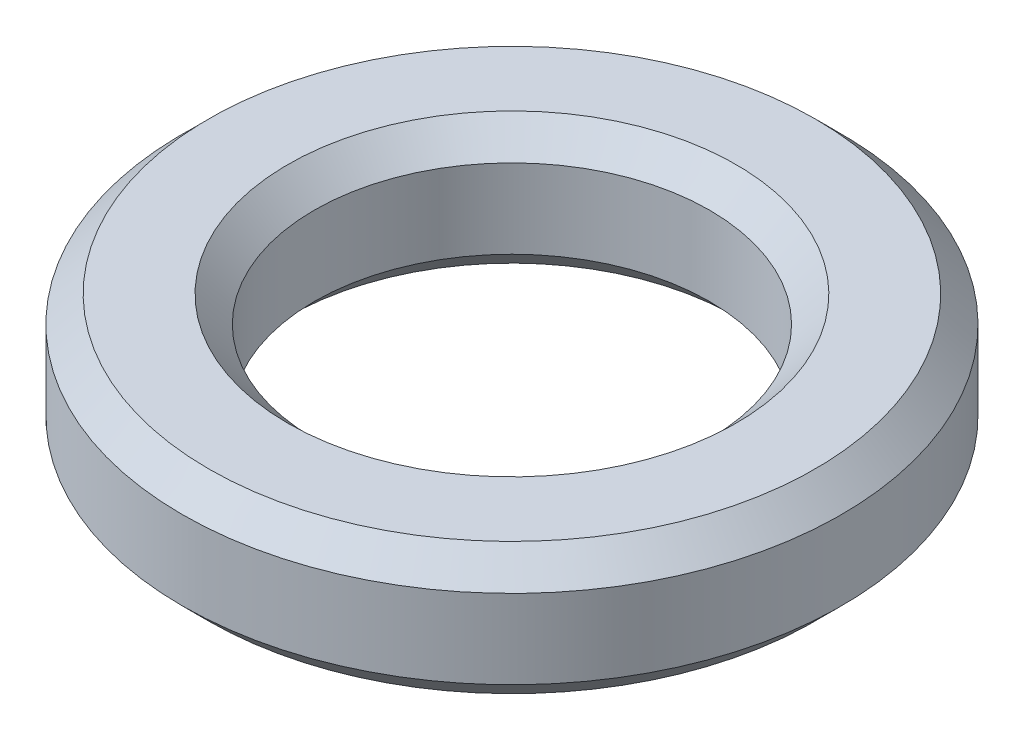
ISO-10303-21;
HEADER;
FILE_DESCRIPTION(('STEP AP214'),'2;1');
FILE_NAME('part.step','',(''),(''),'','','');
FILE_SCHEMA(('AUTOMOTIVE_DESIGN { 1 0 10303 214 1 1 1 1 }'));
ENDSEC;
DATA;
#1=APPLICATION_CONTEXT('core data for automotive mechanical design processes');
#2=APPLICATION_PROTOCOL_DEFINITION('international standard','automotive_design',2000,#1);
#3=PRODUCT_CONTEXT('',#1,'mechanical');
#4=PRODUCT('Part','Part','',(#3));
#5=PRODUCT_RELATED_PRODUCT_CATEGORY('part','',(#4));
#6=PRODUCT_DEFINITION_FORMATION('','',#4);
#7=PRODUCT_DEFINITION_CONTEXT('part definition',#1,'design');
#8=PRODUCT_DEFINITION('design','',#6,#7);
#9=PRODUCT_DEFINITION_SHAPE('','',#8);
#10=(LENGTH_UNIT() NAMED_UNIT(*) SI_UNIT(.MILLI.,.METRE.));
#11=(NAMED_UNIT(*) PLANE_ANGLE_UNIT() SI_UNIT($,.RADIAN.));
#12=(NAMED_UNIT(*) SI_UNIT($,.STERADIAN.) SOLID_ANGLE_UNIT());
#13=UNCERTAINTY_MEASURE_WITH_UNIT(LENGTH_MEASURE(1.E-05),#10,'distance_accuracy_value','');
#14=(GEOMETRIC_REPRESENTATION_CONTEXT(3) GLOBAL_UNCERTAINTY_ASSIGNED_CONTEXT((#13)) GLOBAL_UNIT_ASSIGNED_CONTEXT((#10,
#11,#12)) REPRESENTATION_CONTEXT('',''));
#15=CARTESIAN_POINT('',(0.,0.,0.));
#16=DIRECTION('',(0.,0.,1.));
#17=DIRECTION('',(1.,0.,0.));
#18=AXIS2_PLACEMENT_3D('',#15,#16,#17);
#19=CARTESIAN_POINT('',(0.,24.0064102564103,0.));
#20=DIRECTION('',(0.,1.,0.));
#21=DIRECTION('',(0.,0.,1.));
#22=AXIS2_PLACEMENT_3D('',#19,#20,#21);
#23=CYLINDRICAL_SURFACE('',#22,7.5);
#24=CARTESIAN_POINT('',(0.,-1.01923076923077,0.));
#25=DIRECTION('',(0.,1.,0.));
#26=DIRECTION('',(0.,0.,1.));
#27=AXIS2_PLACEMENT_3D('',#24,#25,#26);
#28=CIRCLE('',#27,7.5);
#29=CARTESIAN_POINT('',(0.,-1.01923076923077,7.5));
#30=VERTEX_POINT('',#29);
#31=EDGE_CURVE('E10',#30,#30,#28,.T.);
#32=ORIENTED_EDGE('',*,*,#31,.F.);
#33=EDGE_LOOP('',(#32));
#34=FACE_BOUND('',#33,.T.);
#35=CARTESIAN_POINT('',(0.,1.98076923076923,0.));
#36=DIRECTION('',(0.,1.,0.));
#37=DIRECTION('',(0.,0.,1.));
#38=AXIS2_PLACEMENT_3D('',#35,#36,#37);
#39=CIRCLE('',#38,7.5);
#40=CARTESIAN_POINT('',(0.,1.98076923076923,7.5));
#41=VERTEX_POINT('',#40);
#42=EDGE_CURVE('E63',#41,#41,#39,.T.);
#43=ORIENTED_EDGE('',*,*,#42,.T.);
#44=EDGE_LOOP('',(#43));
#45=FACE_BOUND('',#44,.T.);
#46=ADVANCED_FACE('F35',(#34,#45),#23,.F.);
#47=CARTESIAN_POINT('',(0.,-1.01923076923077,0.));
#48=DIRECTION('',(0.,-1.,0.));
#49=DIRECTION('',(0.,0.,-1.));
#50=AXIS2_PLACEMENT_3D('',#47,#48,#49);
#51=CONICAL_SURFACE('',#50,7.5,0.785398163397449);
#52=CARTESIAN_POINT('',(0.,-2.01923076923077,0.));
#53=DIRECTION('',(0.,1.,0.));
#54=DIRECTION('',(0.,0.,1.));
#55=AXIS2_PLACEMENT_3D('',#52,#53,#54);
#56=CIRCLE('',#55,8.5);
#57=CARTESIAN_POINT('',(0.,-2.01923076923077,8.5));
#58=VERTEX_POINT('',#57);
#59=EDGE_CURVE('E41',#58,#58,#56,.T.);
#60=ORIENTED_EDGE('',*,*,#59,.F.);
#61=EDGE_LOOP('',(#60));
#62=FACE_BOUND('',#61,.T.);
#63=ORIENTED_EDGE('',*,*,#31,.T.);
#64=EDGE_LOOP('',(#63));
#65=FACE_BOUND('',#64,.T.);
#66=ADVANCED_FACE('F100',(#62,#65),#51,.F.);
#67=CARTESIAN_POINT('',(11.5,-2.01923076923077,0.));
#68=DIRECTION('',(0.,1.,0.));
#69=DIRECTION('',(0.,0.,1.));
#70=AXIS2_PLACEMENT_3D('',#67,#68,#69);
#71=PLANE('',#70);
#72=CARTESIAN_POINT('',(0.,-2.01923076923077,0.));
#73=DIRECTION('',(0.,1.,0.));
#74=DIRECTION('',(0.,0.,1.));
#75=AXIS2_PLACEMENT_3D('',#72,#73,#74);
#76=CIRCLE('',#75,11.5);
#77=CARTESIAN_POINT('',(0.,-2.01923076923077,11.5));
#78=VERTEX_POINT('',#77);
#79=EDGE_CURVE('E45',#78,#78,#76,.T.);
#80=ORIENTED_EDGE('',*,*,#79,.F.);
#81=EDGE_LOOP('',(#80));
#82=FACE_BOUND('',#81,.T.);
#83=ORIENTED_EDGE('',*,*,#59,.T.);
#84=EDGE_LOOP('',(#83));
#85=FACE_BOUND('',#84,.T.);
#86=ADVANCED_FACE('F95',(#82,#85),#71,.F.);
#87=CARTESIAN_POINT('',(0.,-2.01923076923077,0.));
#88=DIRECTION('',(0.,1.,0.));
#89=DIRECTION('',(0.,0.,1.));
#90=AXIS2_PLACEMENT_3D('',#87,#88,#89);
#91=CONICAL_SURFACE('',#90,11.5,0.785398163397449);
#92=CARTESIAN_POINT('',(0.,-1.01923076923077,0.));
#93=DIRECTION('',(0.,1.,0.));
#94=DIRECTION('',(0.,0.,1.));
#95=AXIS2_PLACEMENT_3D('',#92,#93,#94);
#96=CIRCLE('',#95,12.5);
#97=CARTESIAN_POINT('',(0.,-1.01923076923077,12.5));
#98=VERTEX_POINT('',#97);
#99=EDGE_CURVE('E49',#98,#98,#96,.T.);
#100=ORIENTED_EDGE('',*,*,#99,.F.);
#101=EDGE_LOOP('',(#100));
#102=FACE_BOUND('',#101,.T.);
#103=ORIENTED_EDGE('',*,*,#79,.T.);
#104=EDGE_LOOP('',(#103));
#105=FACE_BOUND('',#104,.T.);
#106=ADVANCED_FACE('F89',(#102,#105),#91,.T.);
#107=CARTESIAN_POINT('',(0.,24.0064102564103,0.));
#108=DIRECTION('',(0.,1.,0.));
#109=DIRECTION('',(0.,0.,1.));
#110=AXIS2_PLACEMENT_3D('',#107,#108,#109);
#111=CYLINDRICAL_SURFACE('',#110,12.5);
#112=CARTESIAN_POINT('',(0.,1.98076923076923,0.));
#113=DIRECTION('',(0.,1.,0.));
#114=DIRECTION('',(0.,0.,1.));
#115=AXIS2_PLACEMENT_3D('',#112,#113,#114);
#116=CIRCLE('',#115,12.5);
#117=CARTESIAN_POINT('',(0.,1.98076923076923,12.5));
#118=VERTEX_POINT('',#117);
#119=EDGE_CURVE('E54',#118,#118,#116,.T.);
#120=ORIENTED_EDGE('',*,*,#119,.F.);
#121=EDGE_LOOP('',(#120));
#122=FACE_BOUND('',#121,.T.);
#123=ORIENTED_EDGE('',*,*,#99,.T.);
#124=EDGE_LOOP('',(#123));
#125=FACE_BOUND('',#124,.T.);
#126=ADVANCED_FACE('F83',(#122,#125),#111,.T.);
#127=CARTESIAN_POINT('',(0.,1.98076923076923,0.));
#128=DIRECTION('',(0.,-1.,0.));
#129=DIRECTION('',(0.,0.,-1.));
#130=AXIS2_PLACEMENT_3D('',#127,#128,#129);
#131=CONICAL_SURFACE('',#130,12.5,0.785398163397451);
#132=CARTESIAN_POINT('',(0.,2.98076923076923,0.));
#133=DIRECTION('',(0.,1.,0.));
#134=DIRECTION('',(0.,0.,1.));
#135=AXIS2_PLACEMENT_3D('',#132,#133,#134);
#136=CIRCLE('',#135,11.5);
#137=CARTESIAN_POINT('',(0.,2.98076923076923,11.5));
#138=VERTEX_POINT('',#137);
#139=EDGE_CURVE('E57',#138,#138,#136,.T.);
#140=ORIENTED_EDGE('',*,*,#139,.F.);
#141=EDGE_LOOP('',(#140));
#142=FACE_BOUND('',#141,.T.);
#143=ORIENTED_EDGE('',*,*,#119,.T.);
#144=EDGE_LOOP('',(#143));
#145=FACE_BOUND('',#144,.T.);
#146=ADVANCED_FACE('F77',(#142,#145),#131,.T.);
#147=CARTESIAN_POINT('',(11.5,2.98076923076923,0.));
#148=DIRECTION('',(0.,-1.,0.));
#149=DIRECTION('',(0.,0.,-1.));
#150=AXIS2_PLACEMENT_3D('',#147,#148,#149);
#151=PLANE('',#150);
#152=CARTESIAN_POINT('',(0.,2.98076923076923,0.));
#153=DIRECTION('',(0.,1.,0.));
#154=DIRECTION('',(0.,0.,1.));
#155=AXIS2_PLACEMENT_3D('',#152,#153,#154);
#156=CIRCLE('',#155,8.5);
#157=CARTESIAN_POINT('',(0.,2.98076923076923,8.5));
#158=VERTEX_POINT('',#157);
#159=EDGE_CURVE('E60',#158,#158,#156,.T.);
#160=ORIENTED_EDGE('',*,*,#159,.F.);
#161=EDGE_LOOP('',(#160));
#162=FACE_BOUND('',#161,.T.);
#163=ORIENTED_EDGE('',*,*,#139,.T.);
#164=EDGE_LOOP('',(#163));
#165=FACE_BOUND('',#164,.T.);
#166=ADVANCED_FACE('F71',(#162,#165),#151,.F.);
#167=CARTESIAN_POINT('',(0.,2.98076923076923,0.));
#168=DIRECTION('',(0.,1.,0.));
#169=DIRECTION('',(0.,0.,1.));
#170=AXIS2_PLACEMENT_3D('',#167,#168,#169);
#171=CONICAL_SURFACE('',#170,8.5,0.785398163397451);
#172=ORIENTED_EDGE('',*,*,#42,.F.);
#173=EDGE_LOOP('',(#172));
#174=FACE_BOUND('',#173,.T.);
#175=ORIENTED_EDGE('',*,*,#159,.T.);
#176=EDGE_LOOP('',(#175));
#177=FACE_BOUND('',#176,.T.);
#178=ADVANCED_FACE('F68',(#174,#177),#171,.F.);
#179=CLOSED_SHELL('',(#46,#66,#86,#106,#126,#146,#166,#178));
#180=MANIFOLD_SOLID_BREP('B2',#179);
#181=ADVANCED_BREP_SHAPE_REPRESENTATION('',(#18,#180),#14);
#182=SHAPE_DEFINITION_REPRESENTATION(#9,#181);
ENDSEC;
END-ISO-10303-21;
